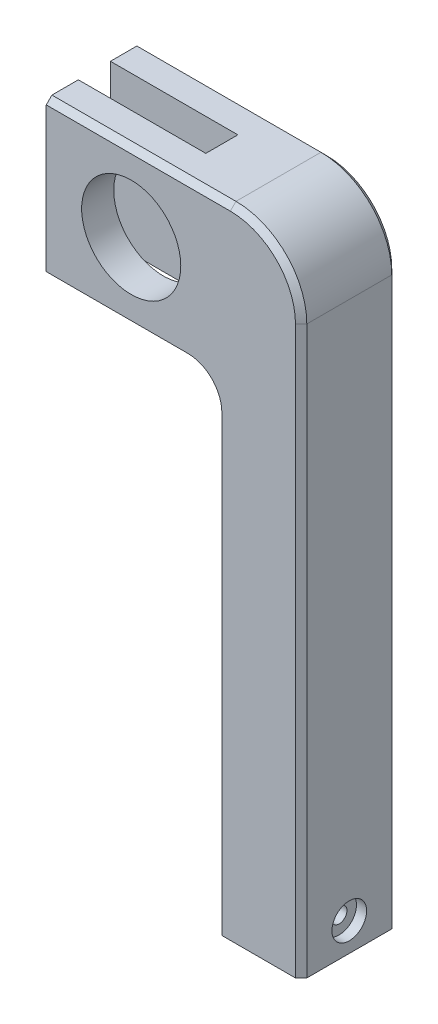
ISO-10303-21;
HEADER;
FILE_DESCRIPTION(('STEP AP214'),'2;1');
FILE_NAME('part.step','',(''),(''),'','','');
FILE_SCHEMA(('AUTOMOTIVE_DESIGN { 1 0 10303 214 1 1 1 1 }'));
ENDSEC;
DATA;
#1=APPLICATION_CONTEXT('core data for automotive mechanical design processes');
#2=APPLICATION_PROTOCOL_DEFINITION('international standard','automotive_design',2000,#1);
#3=PRODUCT_CONTEXT('',#1,'mechanical');
#4=PRODUCT('Part','Part','',(#3));
#5=PRODUCT_RELATED_PRODUCT_CATEGORY('part','',(#4));
#6=PRODUCT_DEFINITION_FORMATION('','',#4);
#7=PRODUCT_DEFINITION_CONTEXT('part definition',#1,'design');
#8=PRODUCT_DEFINITION('design','',#6,#7);
#9=PRODUCT_DEFINITION_SHAPE('','',#8);
#10=(LENGTH_UNIT() NAMED_UNIT(*) SI_UNIT(.MILLI.,.METRE.));
#11=(NAMED_UNIT(*) PLANE_ANGLE_UNIT() SI_UNIT($,.RADIAN.));
#12=(NAMED_UNIT(*) SI_UNIT($,.STERADIAN.) SOLID_ANGLE_UNIT());
#13=UNCERTAINTY_MEASURE_WITH_UNIT(LENGTH_MEASURE(1.E-05),#10,'distance_accuracy_value','');
#14=(GEOMETRIC_REPRESENTATION_CONTEXT(3) GLOBAL_UNCERTAINTY_ASSIGNED_CONTEXT((#13)) GLOBAL_UNIT_ASSIGNED_CONTEXT((#10,
#11,#12)) REPRESENTATION_CONTEXT('',''));
#15=CARTESIAN_POINT('',(0.,0.,0.));
#16=DIRECTION('',(0.,0.,1.));
#17=DIRECTION('',(1.,0.,0.));
#18=AXIS2_PLACEMENT_3D('',#15,#16,#17);
#19=CARTESIAN_POINT('',(-45.,-0.001000000000001,5.66499999999999));
#20=DIRECTION('',(0.,0.,1.));
#21=DIRECTION('',(1.,0.,0.));
#22=AXIS2_PLACEMENT_3D('',#19,#20,#21);
#23=PLANE('',#22);
#24=CARTESIAN_POINT('',(-60.,197.5,5.665));
#25=DIRECTION('',(0.,0.,1.));
#26=DIRECTION('',(1.,0.,0.));
#27=AXIS2_PLACEMENT_3D('',#24,#25,#26);
#28=CIRCLE('',#27,17.5);
#29=CARTESIAN_POINT('',(-45.,188.48612181134,5.66499999999999));
#30=VERTEX_POINT('',#29);
#31=CARTESIAN_POINT('',(-45.,206.51387818866,5.66499999999999));
#32=VERTEX_POINT('',#31);
#33=EDGE_CURVE('E276',#30,#32,#28,.F.);
#34=ORIENTED_EDGE('',*,*,#33,.F.);
#35=DIRECTION('',(0.,1.,0.));
#36=VECTOR('',#35,1.);
#37=CARTESIAN_POINT('',(-45.,-0.001000000000001,5.66499999999999));
#38=LINE('',#37,#36);
#39=CARTESIAN_POINT('',(-45.,170.,5.66499999999999));
#40=VERTEX_POINT('',#39);
#41=EDGE_CURVE('E307',#40,#30,#38,.T.);
#42=ORIENTED_EDGE('',*,*,#41,.F.);
#43=DIRECTION('',(1.,0.,0.));
#44=VECTOR('',#43,1.);
#45=CARTESIAN_POINT('',(-45.,170.,5.66499999999999));
#46=LINE('',#45,#44);
#47=CARTESIAN_POINT('',(-90.,170.,5.665));
#48=VERTEX_POINT('',#47);
#49=EDGE_CURVE('E304',#48,#40,#46,.T.);
#50=ORIENTED_EDGE('',*,*,#49,.F.);
#51=DIRECTION('',(0.,1.,0.));
#52=VECTOR('',#51,1.);
#53=CARTESIAN_POINT('',(-90.,-0.001000000000001,5.665));
#54=LINE('',#53,#52);
#55=CARTESIAN_POINT('',(-90.,225.,5.665));
#56=VERTEX_POINT('',#55);
#57=EDGE_CURVE('E297',#48,#56,#54,.T.);
#58=ORIENTED_EDGE('',*,*,#57,.T.);
#59=DIRECTION('',(1.,0.,0.));
#60=VECTOR('',#59,1.);
#61=CARTESIAN_POINT('',(-45.,225.,5.66499999999999));
#62=LINE('',#61,#60);
#63=CARTESIAN_POINT('',(-45.,225.,5.66499999999999));
#64=VERTEX_POINT('',#63);
#65=EDGE_CURVE('E288',#56,#64,#62,.T.);
#66=ORIENTED_EDGE('',*,*,#65,.T.);
#67=EDGE_CURVE('E313',#32,#64,#38,.T.);
#68=ORIENTED_EDGE('',*,*,#67,.F.);
#69=EDGE_LOOP('',(#34,#42,#50,#58,#66,#68));
#70=FACE_BOUND('',#69,.T.);
#71=ADVANCED_FACE('F50',(#70),#23,.F.);
#72=CARTESIAN_POINT('',(-90.,170.,-17.));
#73=DIRECTION('',(-1.,0.,0.));
#74=DIRECTION('',(0.,-1.,0.));
#75=AXIS2_PLACEMENT_3D('',#72,#73,#74);
#76=PLANE('',#75);
#77=CARTESIAN_POINT('',(-89.9999999999999,175.,-11.33));
#78=DIRECTION('',(-1.,0.,0.));
#79=DIRECTION('',(0.,0.,1.));
#80=AXIS2_PLACEMENT_3D('',#77,#78,#79);
#81=CIRCLE('',#80,1.5);
#82=CARTESIAN_POINT('',(-89.9999999999999,175.,-9.83));
#83=VERTEX_POINT('',#82);
#84=EDGE_CURVE('E214',#83,#83,#81,.T.);
#85=ORIENTED_EDGE('',*,*,#84,.F.);
#86=EDGE_LOOP('',(#85));
#87=FACE_BOUND('',#86,.T.);
#88=CARTESIAN_POINT('',(-89.9999999999999,220.,-11.33));
#89=DIRECTION('',(-1.,0.,0.));
#90=DIRECTION('',(0.,0.,1.));
#91=AXIS2_PLACEMENT_3D('',#88,#89,#90);
#92=CIRCLE('',#91,1.5);
#93=CARTESIAN_POINT('',(-89.9999999999999,220.,-9.83));
#94=VERTEX_POINT('',#93);
#95=EDGE_CURVE('E230',#94,#94,#92,.T.);
#96=ORIENTED_EDGE('',*,*,#95,.F.);
#97=EDGE_LOOP('',(#96));
#98=FACE_BOUND('',#97,.T.);
#99=DIRECTION('',(0.,-1.,0.));
#100=VECTOR('',#99,1.);
#101=CARTESIAN_POINT('',(-90.,170.,-17.));
#102=LINE('',#101,#100);
#103=CARTESIAN_POINT('',(-90.,223.,-17.));
#104=VERTEX_POINT('',#103);
#105=CARTESIAN_POINT('',(-90.,172.,-17.));
#106=VERTEX_POINT('',#105);
#107=EDGE_CURVE('E321',#104,#106,#102,.T.);
#108=ORIENTED_EDGE('',*,*,#107,.T.);
#109=DIRECTION('',(0.,0.707106781186552,-0.707106781186543));
#110=VECTOR('',#109,1.);
#111=CARTESIAN_POINT('',(-90.,171.,-16.));
#112=LINE('',#111,#110);
#113=CARTESIAN_POINT('',(-90.,170.,-14.9999999999999));
#114=VERTEX_POINT('',#113);
#115=EDGE_CURVE('E444',#106,#114,#112,.F.);
#116=ORIENTED_EDGE('',*,*,#115,.T.);
#117=DIRECTION('',(0.,0.,1.));
#118=VECTOR('',#117,1.);
#119=CARTESIAN_POINT('',(-90.,170.,-17.));
#120=LINE('',#119,#118);
#121=CARTESIAN_POINT('',(-90.,170.,-5.665));
#122=VERTEX_POINT('',#121);
#123=EDGE_CURVE('E348',#114,#122,#120,.T.);
#124=ORIENTED_EDGE('',*,*,#123,.T.);
#125=DIRECTION('',(0.,1.,0.));
#126=VECTOR('',#125,1.);
#127=CARTESIAN_POINT('',(-90.,-0.001000000000001,-5.665));
#128=LINE('',#127,#126);
#129=CARTESIAN_POINT('',(-90.,225.,-5.665));
#130=VERTEX_POINT('',#129);
#131=EDGE_CURVE('E301',#122,#130,#128,.T.);
#132=ORIENTED_EDGE('',*,*,#131,.T.);
#133=DIRECTION('',(0.,0.,1.));
#134=VECTOR('',#133,1.);
#135=CARTESIAN_POINT('',(-90.,225.,-17.));
#136=LINE('',#135,#134);
#137=CARTESIAN_POINT('',(-90.,225.,-15.));
#138=VERTEX_POINT('',#137);
#139=EDGE_CURVE('E347',#138,#130,#136,.T.);
#140=ORIENTED_EDGE('',*,*,#139,.F.);
#141=DIRECTION('',(0.,0.707106781186552,0.707106781186543));
#142=VECTOR('',#141,1.);
#143=CARTESIAN_POINT('',(-90.,196.5,-43.5));
#144=LINE('',#143,#142);
#145=EDGE_CURVE('E445',#138,#104,#144,.F.);
#146=ORIENTED_EDGE('',*,*,#145,.T.);
#147=EDGE_LOOP('',(#108,#116,#124,#132,#140,#146));
#148=FACE_BOUND('',#147,.T.);
#149=ADVANCED_FACE('F576',(#87,#98,#148),#76,.T.);
#150=CARTESIAN_POINT('',(-30.,170.,-17.));
#151=DIRECTION('',(0.,-1.,0.));
#152=DIRECTION('',(0.,0.,-1.));
#153=AXIS2_PLACEMENT_3D('',#150,#151,#152);
#154=PLANE('',#153);
#155=DIRECTION('',(0.,0.,1.));
#156=VECTOR('',#155,1.);
#157=CARTESIAN_POINT('',(-40.,170.,17.));
#158=LINE('',#157,#156);
#159=CARTESIAN_POINT('',(-40.,170.,-14.9999999999999));
#160=VERTEX_POINT('',#159);
#161=CARTESIAN_POINT('',(-40.,170.,15.));
#162=VERTEX_POINT('',#161);
#163=EDGE_CURVE('E360',#160,#162,#158,.T.);
#164=ORIENTED_EDGE('',*,*,#163,.T.);
#165=DIRECTION('',(-1.,0.,0.));
#166=VECTOR('',#165,1.);
#167=CARTESIAN_POINT('',(-90.,170.,15.));
#168=LINE('',#167,#166);
#169=CARTESIAN_POINT('',(-90.,170.,15.));
#170=VERTEX_POINT('',#169);
#171=EDGE_CURVE('E393',#162,#170,#168,.T.);
#172=ORIENTED_EDGE('',*,*,#171,.T.);
#173=EDGE_CURVE('E349',#48,#170,#120,.T.);
#174=ORIENTED_EDGE('',*,*,#173,.F.);
#175=ORIENTED_EDGE('',*,*,#49,.T.);
#176=DIRECTION('',(0.,0.,-1.));
#177=VECTOR('',#176,1.);
#178=CARTESIAN_POINT('',(-45.,170.,5.66499999999999));
#179=LINE('',#178,#177);
#180=CARTESIAN_POINT('',(-45.,170.,-5.66499999999999));
#181=VERTEX_POINT('',#180);
#182=EDGE_CURVE('E279',#40,#181,#179,.T.);
#183=ORIENTED_EDGE('',*,*,#182,.T.);
#184=DIRECTION('',(-1.,0.,0.));
#185=VECTOR('',#184,1.);
#186=CARTESIAN_POINT('',(-45.,170.,-5.66499999999999));
#187=LINE('',#186,#185);
#188=EDGE_CURVE('E284',#181,#122,#187,.T.);
#189=ORIENTED_EDGE('',*,*,#188,.T.);
#190=ORIENTED_EDGE('',*,*,#123,.F.);
#191=DIRECTION('',(1.,0.,0.));
#192=VECTOR('',#191,1.);
#193=CARTESIAN_POINT('',(-30.,170.,-14.9999999999999));
#194=LINE('',#193,#192);
#195=EDGE_CURVE('E390',#114,#160,#194,.T.);
#196=ORIENTED_EDGE('',*,*,#195,.T.);
#197=EDGE_LOOP('',(#164,#172,#174,#175,#183,#189,#190,#196));
#198=FACE_BOUND('',#197,.T.);
#199=ADVANCED_FACE('F553',(#198),#154,.T.);
#200=CARTESIAN_POINT('',(0.,225.,-17.));
#201=DIRECTION('',(1.,0.,0.));
#202=DIRECTION('',(0.,1.,0.));
#203=AXIS2_PLACEMENT_3D('',#200,#201,#202);
#204=PLANE('',#203);
#205=CARTESIAN_POINT('',(0.,10.,0.));
#206=DIRECTION('',(1.,0.,0.));
#207=DIRECTION('',(0.,0.,-1.));
#208=AXIS2_PLACEMENT_3D('',#205,#206,#207);
#209=CIRCLE('',#208,6.12);
#210=CARTESIAN_POINT('',(0.,10.,-6.12));
#211=VERTEX_POINT('',#210);
#212=EDGE_CURVE('E244',#211,#211,#209,.T.);
#213=ORIENTED_EDGE('',*,*,#212,.F.);
#214=EDGE_LOOP('',(#213));
#215=FACE_BOUND('',#214,.T.);
#216=DIRECTION('',(0.,0.,1.));
#217=VECTOR('',#216,1.);
#218=CARTESIAN_POINT('',(0.,0.,-17.));
#219=LINE('',#218,#217);
#220=CARTESIAN_POINT('',(0.,0.,-15.));
#221=VERTEX_POINT('',#220);
#222=CARTESIAN_POINT('',(0.,0.,15.));
#223=VERTEX_POINT('',#222);
#224=EDGE_CURVE('E340',#221,#223,#219,.T.);
#225=ORIENTED_EDGE('',*,*,#224,.F.);
#226=DIRECTION('',(0.,1.,0.));
#227=VECTOR('',#226,1.);
#228=CARTESIAN_POINT('',(0.,225.,-15.));
#229=LINE('',#228,#227);
#230=CARTESIAN_POINT('',(0.,200.,-15.));
#231=VERTEX_POINT('',#230);
#232=EDGE_CURVE('E11',#221,#231,#229,.T.);
#233=ORIENTED_EDGE('',*,*,#232,.T.);
#234=DIRECTION('',(0.,0.,1.));
#235=VECTOR('',#234,1.);
#236=CARTESIAN_POINT('',(0.,200.,-17.));
#237=LINE('',#236,#235);
#238=CARTESIAN_POINT('',(0.,200.,15.));
#239=VERTEX_POINT('',#238);
#240=EDGE_CURVE('E341',#231,#239,#237,.T.);
#241=ORIENTED_EDGE('',*,*,#240,.T.);
#242=DIRECTION('',(0.,-1.,0.));
#243=VECTOR('',#242,1.);
#244=CARTESIAN_POINT('',(0.,0.,15.));
#245=LINE('',#244,#243);
#246=EDGE_CURVE('E59',#239,#223,#245,.T.);
#247=ORIENTED_EDGE('',*,*,#246,.T.);
#248=EDGE_LOOP('',(#225,#233,#241,#247));
#249=FACE_BOUND('',#248,.T.);
#250=ADVANCED_FACE('F498',(#215,#249),#204,.T.);
#251=CARTESIAN_POINT('',(0.,0.,-17.));
#252=DIRECTION('',(0.,-1.,0.));
#253=DIRECTION('',(1.,0.,0.));
#254=AXIS2_PLACEMENT_3D('',#251,#252,#253);
#255=PLANE('',#254);
#256=DIRECTION('',(1.,0.,0.));
#257=VECTOR('',#256,1.);
#258=CARTESIAN_POINT('',(0.,0.,17.));
#259=LINE('',#258,#257);
#260=CARTESIAN_POINT('',(-28.,0.,17.));
#261=VERTEX_POINT('',#260);
#262=CARTESIAN_POINT('',(-1.99999999999997,0.,17.));
#263=VERTEX_POINT('',#262);
#264=EDGE_CURVE('E328',#261,#263,#259,.T.);
#265=ORIENTED_EDGE('',*,*,#264,.F.);
#266=DIRECTION('',(-0.707106781186543,0.,-0.707106781186552));
#267=VECTOR('',#266,1.);
#268=CARTESIAN_POINT('',(-31.0000000000002,0.,13.9999999999998));
#269=LINE('',#268,#267);
#270=CARTESIAN_POINT('',(-30.,0.,15.));
#271=VERTEX_POINT('',#270);
#272=EDGE_CURVE('E412',#261,#271,#269,.T.);
#273=ORIENTED_EDGE('',*,*,#272,.T.);
#274=DIRECTION('',(0.,0.,1.));
#275=VECTOR('',#274,1.);
#276=CARTESIAN_POINT('',(-30.,0.,-17.));
#277=LINE('',#276,#275);
#278=CARTESIAN_POINT('',(-30.,0.,-14.9999999999999));
#279=VERTEX_POINT('',#278);
#280=EDGE_CURVE('E345',#279,#271,#277,.T.);
#281=ORIENTED_EDGE('',*,*,#280,.F.);
#282=DIRECTION('',(-0.707106781186552,0.,0.707106781186543));
#283=VECTOR('',#282,1.);
#284=CARTESIAN_POINT('',(-13.9999999999998,0.,-31.));
#285=LINE('',#284,#283);
#286=CARTESIAN_POINT('',(-27.9999999999999,0.,-17.));
#287=VERTEX_POINT('',#286);
#288=EDGE_CURVE('E415',#279,#287,#285,.F.);
#289=ORIENTED_EDGE('',*,*,#288,.T.);
#290=DIRECTION('',(1.,0.,0.));
#291=VECTOR('',#290,1.);
#292=CARTESIAN_POINT('',(0.,0.,-17.));
#293=LINE('',#292,#291);
#294=CARTESIAN_POINT('',(-2.00000000000006,0.,-17.));
#295=VERTEX_POINT('',#294);
#296=EDGE_CURVE('E324',#287,#295,#293,.T.);
#297=ORIENTED_EDGE('',*,*,#296,.T.);
#298=DIRECTION('',(-0.707106781186552,0.,-0.707106781186543));
#299=VECTOR('',#298,1.);
#300=CARTESIAN_POINT('',(-1.00000000000001,0.,-16.));
#301=LINE('',#300,#299);
#302=EDGE_CURVE('E408',#295,#221,#301,.F.);
#303=ORIENTED_EDGE('',*,*,#302,.T.);
#304=ORIENTED_EDGE('',*,*,#224,.T.);
#305=DIRECTION('',(-0.707106781186548,0.,0.707106781186548));
#306=VECTOR('',#305,1.);
#307=CARTESIAN_POINT('',(16.,0.,-0.999999999999987));
#308=LINE('',#307,#306);
#309=EDGE_CURVE('E406',#223,#263,#308,.T.);
#310=ORIENTED_EDGE('',*,*,#309,.T.);
#311=EDGE_LOOP('',(#265,#273,#281,#289,#297,#303,#304,#310));
#312=FACE_BOUND('',#311,.T.);
#313=ADVANCED_FACE('F501',(#312),#255,.T.);
#314=CARTESIAN_POINT('',(-30.,170.,-17.));
#315=DIRECTION('',(-1.,0.,0.));
#316=DIRECTION('',(0.,-1.,0.));
#317=AXIS2_PLACEMENT_3D('',#314,#315,#316);
#318=PLANE('',#317);
#319=CARTESIAN_POINT('',(-30.,10.,0.));
#320=DIRECTION('',(-1.,0.,0.));
#321=DIRECTION('',(0.,-1.,0.));
#322=AXIS2_PLACEMENT_3D('',#319,#320,#321);
#323=CIRCLE('',#322,2.75);
#324=CARTESIAN_POINT('',(-30.,7.25,0.));
#325=VERTEX_POINT('',#324);
#326=EDGE_CURVE('E260',#325,#325,#323,.T.);
#327=ORIENTED_EDGE('',*,*,#326,.F.);
#328=EDGE_LOOP('',(#327));
#329=FACE_BOUND('',#328,.T.);
#330=ORIENTED_EDGE('',*,*,#280,.T.);
#331=DIRECTION('',(0.,1.,0.));
#332=VECTOR('',#331,1.);
#333=CARTESIAN_POINT('',(-30.,160.,15.));
#334=LINE('',#333,#332);
#335=CARTESIAN_POINT('',(-30.,160.,15.));
#336=VERTEX_POINT('',#335);
#337=EDGE_CURVE('E423',#271,#336,#334,.T.);
#338=ORIENTED_EDGE('',*,*,#337,.T.);
#339=DIRECTION('',(0.,0.,1.));
#340=VECTOR('',#339,1.);
#341=CARTESIAN_POINT('',(-30.,160.,-17.));
#342=LINE('',#341,#340);
#343=CARTESIAN_POINT('',(-30.,160.,-14.9999999999999));
#344=VERTEX_POINT('',#343);
#345=EDGE_CURVE('E361',#336,#344,#342,.F.);
#346=ORIENTED_EDGE('',*,*,#345,.T.);
#347=DIRECTION('',(0.,-1.,0.));
#348=VECTOR('',#347,1.);
#349=CARTESIAN_POINT('',(-30.,170.,-14.9999999999999));
#350=LINE('',#349,#348);
#351=EDGE_CURVE('E418',#344,#279,#350,.T.);
#352=ORIENTED_EDGE('',*,*,#351,.T.);
#353=EDGE_LOOP('',(#330,#338,#346,#352));
#354=FACE_BOUND('',#353,.T.);
#355=ADVANCED_FACE('F566',(#329,#354),#318,.T.);
#356=CARTESIAN_POINT('',(-89.9999999999999,220.,11.33));
#357=DIRECTION('',(-1.,0.,0.));
#358=DIRECTION('',(0.,0.,1.));
#359=AXIS2_PLACEMENT_3D('',#356,#357,#358);
#360=CIRCLE('',#359,1.5);
#361=CARTESIAN_POINT('',(-89.9999999999999,220.,12.83));
#362=VERTEX_POINT('',#361);
#363=EDGE_CURVE('E218',#362,#362,#360,.T.);
#364=ORIENTED_EDGE('',*,*,#363,.F.);
#365=EDGE_LOOP('',(#364));
#366=FACE_BOUND('',#365,.T.);
#367=CARTESIAN_POINT('',(-89.9999999999999,175.,11.33));
#368=DIRECTION('',(-1.,0.,0.));
#369=DIRECTION('',(0.,0.,1.));
#370=AXIS2_PLACEMENT_3D('',#367,#368,#369);
#371=CIRCLE('',#370,1.5);
#372=CARTESIAN_POINT('',(-89.9999999999999,175.,12.83));
#373=VERTEX_POINT('',#372);
#374=EDGE_CURVE('E240',#373,#373,#371,.T.);
#375=ORIENTED_EDGE('',*,*,#374,.F.);
#376=EDGE_LOOP('',(#375));
#377=FACE_BOUND('',#376,.T.);
#378=ORIENTED_EDGE('',*,*,#173,.T.);
#379=DIRECTION('',(0.,0.707106781186543,0.707106781186552));
#380=VECTOR('',#379,1.);
#381=CARTESIAN_POINT('',(-90.,154.,-1.00000000000024));
#382=LINE('',#381,#380);
#383=CARTESIAN_POINT('',(-90.,172.,17.));
#384=VERTEX_POINT('',#383);
#385=EDGE_CURVE('E400',#170,#384,#382,.T.);
#386=ORIENTED_EDGE('',*,*,#385,.T.);
#387=DIRECTION('',(0.,-1.,0.));
#388=VECTOR('',#387,1.);
#389=CARTESIAN_POINT('',(-90.,170.,17.));
#390=LINE('',#389,#388);
#391=CARTESIAN_POINT('',(-90.,223.,17.));
#392=VERTEX_POINT('',#391);
#393=EDGE_CURVE('E318',#392,#384,#390,.T.);
#394=ORIENTED_EDGE('',*,*,#393,.F.);
#395=DIRECTION('',(0.,0.707106781186548,-0.707106781186548));
#396=VECTOR('',#395,1.);
#397=CARTESIAN_POINT('',(-90.,213.5,26.5));
#398=LINE('',#397,#396);
#399=CARTESIAN_POINT('',(-90.,225.,15.));
#400=VERTEX_POINT('',#399);
#401=EDGE_CURVE('E394',#392,#400,#398,.T.);
#402=ORIENTED_EDGE('',*,*,#401,.T.);
#403=EDGE_CURVE('E327',#56,#400,#136,.T.);
#404=ORIENTED_EDGE('',*,*,#403,.F.);
#405=ORIENTED_EDGE('',*,*,#57,.F.);
#406=EDGE_LOOP('',(#378,#386,#394,#402,#404,#405));
#407=FACE_BOUND('',#406,.T.);
#408=ADVANCED_FACE('F528',(#366,#377,#407),#76,.T.);
#409=CARTESIAN_POINT('',(-90.,225.,-17.));
#410=DIRECTION('',(0.,1.,0.));
#411=DIRECTION('',(0.,0.,1.));
#412=AXIS2_PLACEMENT_3D('',#409,#410,#411);
#413=PLANE('',#412);
#414=DIRECTION('',(0.,0.,1.));
#415=VECTOR('',#414,1.);
#416=CARTESIAN_POINT('',(-25.,225.,-17.));
#417=LINE('',#416,#415);
#418=CARTESIAN_POINT('',(-25.,225.,15.));
#419=VERTEX_POINT('',#418);
#420=CARTESIAN_POINT('',(-25.,225.,-15.));
#421=VERTEX_POINT('',#420);
#422=EDGE_CURVE('E351',#419,#421,#417,.F.);
#423=ORIENTED_EDGE('',*,*,#422,.T.);
#424=DIRECTION('',(-1.,0.,0.));
#425=VECTOR('',#424,1.);
#426=CARTESIAN_POINT('',(-90.,225.,-15.));
#427=LINE('',#426,#425);
#428=EDGE_CURVE('E451',#421,#138,#427,.T.);
#429=ORIENTED_EDGE('',*,*,#428,.T.);
#430=ORIENTED_EDGE('',*,*,#139,.T.);
#431=DIRECTION('',(-1.,0.,0.));
#432=VECTOR('',#431,1.);
#433=CARTESIAN_POINT('',(-45.,225.,-5.66499999999999));
#434=LINE('',#433,#432);
#435=CARTESIAN_POINT('',(-45.,225.,-5.66499999999999));
#436=VERTEX_POINT('',#435);
#437=EDGE_CURVE('E298',#436,#130,#434,.T.);
#438=ORIENTED_EDGE('',*,*,#437,.F.);
#439=DIRECTION('',(0.,0.,-1.));
#440=VECTOR('',#439,1.);
#441=CARTESIAN_POINT('',(-45.,225.,5.66499999999999));
#442=LINE('',#441,#440);
#443=EDGE_CURVE('E292',#64,#436,#442,.T.);
#444=ORIENTED_EDGE('',*,*,#443,.F.);
#445=ORIENTED_EDGE('',*,*,#65,.F.);
#446=ORIENTED_EDGE('',*,*,#403,.T.);
#447=DIRECTION('',(1.,0.,0.));
#448=VECTOR('',#447,1.);
#449=CARTESIAN_POINT('',(-25.,225.,15.));
#450=LINE('',#449,#448);
#451=EDGE_CURVE('E449',#400,#419,#450,.T.);
#452=ORIENTED_EDGE('',*,*,#451,.T.);
#453=EDGE_LOOP('',(#423,#429,#430,#438,#444,#445,#446,#452));
#454=FACE_BOUND('',#453,.T.);
#455=ADVANCED_FACE('F516',(#454),#413,.T.);
#456=CARTESIAN_POINT('',(0.,0.,-17.));
#457=DIRECTION('',(0.,0.,-1.));
#458=DIRECTION('',(-1.,0.,0.));
#459=AXIS2_PLACEMENT_3D('',#456,#457,#458);
#460=PLANE('',#459);
#461=CARTESIAN_POINT('',(-60.,197.5,-17.));
#462=DIRECTION('',(0.,0.,-1.));
#463=DIRECTION('',(-1.,0.,0.));
#464=AXIS2_PLACEMENT_3D('',#461,#462,#463);
#465=CIRCLE('',#464,11.375);
#466=CARTESIAN_POINT('',(-71.375,197.5,-17.));
#467=VERTEX_POINT('',#466);
#468=EDGE_CURVE('E265',#467,#467,#465,.T.);
#469=ORIENTED_EDGE('',*,*,#468,.F.);
#470=EDGE_LOOP('',(#469));
#471=FACE_BOUND('',#470,.T.);
#472=CARTESIAN_POINT('',(-40.,160.,-17.));
#473=DIRECTION('',(0.,0.,-1.));
#474=DIRECTION('',(-1.,0.,0.));
#475=AXIS2_PLACEMENT_3D('',#472,#473,#474);
#476=CIRCLE('',#475,12.0000000000001);
#477=CARTESIAN_POINT('',(-27.9999999999999,160.,-17.));
#478=VERTEX_POINT('',#477);
#479=CARTESIAN_POINT('',(-40.,172.,-17.));
#480=VERTEX_POINT('',#479);
#481=EDGE_CURVE('E436',#478,#480,#476,.F.);
#482=ORIENTED_EDGE('',*,*,#481,.T.);
#483=DIRECTION('',(-1.,0.,0.));
#484=VECTOR('',#483,1.);
#485=CARTESIAN_POINT('',(0.,172.,-17.));
#486=LINE('',#485,#484);
#487=EDGE_CURVE('E437',#480,#106,#486,.T.);
#488=ORIENTED_EDGE('',*,*,#487,.T.);
#489=ORIENTED_EDGE('',*,*,#107,.F.);
#490=DIRECTION('',(1.,0.,0.));
#491=VECTOR('',#490,1.);
#492=CARTESIAN_POINT('',(0.,223.,-17.));
#493=LINE('',#492,#491);
#494=CARTESIAN_POINT('',(-25.,223.,-17.));
#495=VERTEX_POINT('',#494);
#496=EDGE_CURVE('E427',#104,#495,#493,.T.);
#497=ORIENTED_EDGE('',*,*,#496,.T.);
#498=CARTESIAN_POINT('',(-25.,200.,-17.));
#499=DIRECTION('',(0.,0.,-1.));
#500=DIRECTION('',(-1.,0.,0.));
#501=AXIS2_PLACEMENT_3D('',#498,#499,#500);
#502=CIRCLE('',#501,22.9999999999999);
#503=CARTESIAN_POINT('',(-2.00000000000005,200.,-17.));
#504=VERTEX_POINT('',#503);
#505=EDGE_CURVE('E430',#495,#504,#502,.T.);
#506=ORIENTED_EDGE('',*,*,#505,.T.);
#507=DIRECTION('',(0.,-1.,0.));
#508=VECTOR('',#507,1.);
#509=CARTESIAN_POINT('',(-2.00000000000006,0.,-17.));
#510=LINE('',#509,#508);
#511=EDGE_CURVE('E425',#504,#295,#510,.T.);
#512=ORIENTED_EDGE('',*,*,#511,.T.);
#513=ORIENTED_EDGE('',*,*,#296,.F.);
#514=DIRECTION('',(0.,1.,0.));
#515=VECTOR('',#514,1.);
#516=CARTESIAN_POINT('',(-27.9999999999999,0.,-17.));
#517=LINE('',#516,#515);
#518=EDGE_CURVE('E433',#287,#478,#517,.T.);
#519=ORIENTED_EDGE('',*,*,#518,.T.);
#520=EDGE_LOOP('',(#482,#488,#489,#497,#506,#512,#513,#519));
#521=FACE_BOUND('',#520,.T.);
#522=ADVANCED_FACE('F572',(#471,#521),#460,.T.);
#523=CARTESIAN_POINT('',(0.,0.,17.));
#524=DIRECTION('',(0.,0.,-1.));
#525=DIRECTION('',(-1.,0.,0.));
#526=AXIS2_PLACEMENT_3D('',#523,#524,#525);
#527=PLANE('',#526);
#528=CARTESIAN_POINT('',(-60.,197.5,17.));
#529=DIRECTION('',(0.,0.,1.));
#530=DIRECTION('',(1.,0.,0.));
#531=AXIS2_PLACEMENT_3D('',#528,#529,#530);
#532=CIRCLE('',#531,17.5);
#533=CARTESIAN_POINT('',(-42.5,197.5,17.));
#534=VERTEX_POINT('',#533);
#535=EDGE_CURVE('E272',#534,#534,#532,.T.);
#536=ORIENTED_EDGE('',*,*,#535,.F.);
#537=EDGE_LOOP('',(#536));
#538=FACE_BOUND('',#537,.T.);
#539=ORIENTED_EDGE('',*,*,#393,.T.);
#540=DIRECTION('',(1.,0.,0.));
#541=VECTOR('',#540,1.);
#542=CARTESIAN_POINT('',(-40.,172.,17.));
#543=LINE('',#542,#541);
#544=CARTESIAN_POINT('',(-40.,172.,17.));
#545=VERTEX_POINT('',#544);
#546=EDGE_CURVE('E384',#384,#545,#543,.T.);
#547=ORIENTED_EDGE('',*,*,#546,.T.);
#548=CARTESIAN_POINT('',(-40.,160.,17.));
#549=DIRECTION('',(0.,0.,-1.));
#550=DIRECTION('',(-1.,0.,0.));
#551=AXIS2_PLACEMENT_3D('',#548,#549,#550);
#552=CIRCLE('',#551,12.);
#553=CARTESIAN_POINT('',(-28.,160.,17.));
#554=VERTEX_POINT('',#553);
#555=EDGE_CURVE('E379',#545,#554,#552,.T.);
#556=ORIENTED_EDGE('',*,*,#555,.T.);
#557=DIRECTION('',(0.,-1.,0.));
#558=VECTOR('',#557,1.);
#559=CARTESIAN_POINT('',(-28.,0.,17.));
#560=LINE('',#559,#558);
#561=EDGE_CURVE('E380',#554,#261,#560,.T.);
#562=ORIENTED_EDGE('',*,*,#561,.T.);
#563=ORIENTED_EDGE('',*,*,#264,.T.);
#564=DIRECTION('',(0.,1.,0.));
#565=VECTOR('',#564,1.);
#566=CARTESIAN_POINT('',(-1.99999999999997,200.,17.));
#567=LINE('',#566,#565);
#568=CARTESIAN_POINT('',(-1.99999999999997,200.,17.));
#569=VERTEX_POINT('',#568);
#570=EDGE_CURVE('E370',#263,#569,#567,.T.);
#571=ORIENTED_EDGE('',*,*,#570,.T.);
#572=CARTESIAN_POINT('',(-25.,200.,17.));
#573=DIRECTION('',(0.,0.,-1.));
#574=DIRECTION('',(-1.,0.,0.));
#575=AXIS2_PLACEMENT_3D('',#572,#573,#574);
#576=CIRCLE('',#575,23.);
#577=CARTESIAN_POINT('',(-25.,223.,17.));
#578=VERTEX_POINT('',#577);
#579=EDGE_CURVE('E369',#569,#578,#576,.F.);
#580=ORIENTED_EDGE('',*,*,#579,.T.);
#581=DIRECTION('',(-1.,0.,0.));
#582=VECTOR('',#581,1.);
#583=CARTESIAN_POINT('',(-90.,223.,17.));
#584=LINE('',#583,#582);
#585=EDGE_CURVE('E373',#578,#392,#584,.T.);
#586=ORIENTED_EDGE('',*,*,#585,.T.);
#587=EDGE_LOOP('',(#539,#547,#556,#562,#563,#571,#580,#586));
#588=FACE_BOUND('',#587,.T.);
#589=ADVANCED_FACE('F522',(#538,#588),#527,.F.);
#590=CARTESIAN_POINT('',(-45.,-0.001000000000001,-5.66499999999999));
#591=DIRECTION('',(0.,0.,-1.));
#592=DIRECTION('',(-1.,0.,0.));
#593=AXIS2_PLACEMENT_3D('',#590,#591,#592);
#594=PLANE('',#593);
#595=CARTESIAN_POINT('',(-60.,197.5,-5.665));
#596=DIRECTION('',(0.,0.,-1.));
#597=DIRECTION('',(-1.,0.,0.));
#598=AXIS2_PLACEMENT_3D('',#595,#596,#597);
#599=CIRCLE('',#598,11.375);
#600=CARTESIAN_POINT('',(-71.375,197.5,-5.665));
#601=VERTEX_POINT('',#600);
#602=EDGE_CURVE('E267',#601,#601,#599,.F.);
#603=ORIENTED_EDGE('',*,*,#602,.F.);
#604=EDGE_LOOP('',(#603));
#605=FACE_BOUND('',#604,.T.);
#606=DIRECTION('',(0.,1.,0.));
#607=VECTOR('',#606,1.);
#608=CARTESIAN_POINT('',(-45.,-0.001000000000001,-5.66499999999999));
#609=LINE('',#608,#607);
#610=EDGE_CURVE('E306',#181,#436,#609,.T.);
#611=ORIENTED_EDGE('',*,*,#610,.T.);
#612=ORIENTED_EDGE('',*,*,#437,.T.);
#613=ORIENTED_EDGE('',*,*,#131,.F.);
#614=ORIENTED_EDGE('',*,*,#188,.F.);
#615=EDGE_LOOP('',(#611,#612,#613,#614));
#616=FACE_BOUND('',#615,.T.);
#617=ADVANCED_FACE('F583',(#605,#616),#594,.F.);
#618=CARTESIAN_POINT('',(-45.,-0.001000000000001,5.66499999999999));
#619=DIRECTION('',(1.,0.,0.));
#620=DIRECTION('',(0.,0.,-1.));
#621=AXIS2_PLACEMENT_3D('',#618,#619,#620);
#622=PLANE('',#621);
#623=ORIENTED_EDGE('',*,*,#41,.T.);
#624=EDGE_CURVE('E312',#30,#32,#38,.T.);
#625=ORIENTED_EDGE('',*,*,#624,.T.);
#626=ORIENTED_EDGE('',*,*,#67,.T.);
#627=ORIENTED_EDGE('',*,*,#443,.T.);
#628=ORIENTED_EDGE('',*,*,#610,.F.);
#629=ORIENTED_EDGE('',*,*,#182,.F.);
#630=EDGE_LOOP('',(#623,#625,#626,#627,#628,#629));
#631=FACE_BOUND('',#630,.T.);
#632=ADVANCED_FACE('F590',(#631),#622,.F.);
#633=CARTESIAN_POINT('',(-25.,200.,-17.));
#634=DIRECTION('',(0.,0.,1.));
#635=DIRECTION('',(1.,0.,0.));
#636=AXIS2_PLACEMENT_3D('',#633,#634,#635);
#637=CYLINDRICAL_SURFACE('',#636,25.);
#638=ORIENTED_EDGE('',*,*,#240,.F.);
#639=CARTESIAN_POINT('',(-25.,200.,-15.));
#640=DIRECTION('',(0.,0.,-1.));
#641=DIRECTION('',(-1.,0.,0.));
#642=AXIS2_PLACEMENT_3D('',#639,#640,#641);
#643=CIRCLE('',#642,25.);
#644=EDGE_CURVE('E460',#231,#421,#643,.F.);
#645=ORIENTED_EDGE('',*,*,#644,.T.);
#646=ORIENTED_EDGE('',*,*,#422,.F.);
#647=CARTESIAN_POINT('',(-25.,200.,15.));
#648=DIRECTION('',(0.,0.,-1.));
#649=DIRECTION('',(-1.,0.,0.));
#650=AXIS2_PLACEMENT_3D('',#647,#648,#649);
#651=CIRCLE('',#650,25.);
#652=EDGE_CURVE('E68',#419,#239,#651,.T.);
#653=ORIENTED_EDGE('',*,*,#652,.T.);
#654=EDGE_LOOP('',(#638,#645,#646,#653));
#655=FACE_BOUND('',#654,.T.);
#656=ADVANCED_FACE('F511',(#655),#637,.T.);
#657=CARTESIAN_POINT('',(-40.,160.,-17.));
#658=DIRECTION('',(0.,0.,-1.));
#659=DIRECTION('',(-1.,0.,0.));
#660=AXIS2_PLACEMENT_3D('',#657,#658,#659);
#661=CYLINDRICAL_SURFACE('',#660,10.);
#662=ORIENTED_EDGE('',*,*,#345,.F.);
#663=CARTESIAN_POINT('',(-40.,160.,15.));
#664=DIRECTION('',(0.,0.,-1.));
#665=DIRECTION('',(-1.,0.,0.));
#666=AXIS2_PLACEMENT_3D('',#663,#664,#665);
#667=CIRCLE('',#666,10.);
#668=EDGE_CURVE('E401',#336,#162,#667,.F.);
#669=ORIENTED_EDGE('',*,*,#668,.T.);
#670=ORIENTED_EDGE('',*,*,#163,.F.);
#671=CARTESIAN_POINT('',(-40.,160.,-14.9999999999999));
#672=DIRECTION('',(0.,0.,-1.));
#673=DIRECTION('',(-1.,0.,0.));
#674=AXIS2_PLACEMENT_3D('',#671,#672,#673);
#675=CIRCLE('',#674,10.);
#676=EDGE_CURVE('E396',#160,#344,#675,.T.);
#677=ORIENTED_EDGE('',*,*,#676,.T.);
#678=EDGE_LOOP('',(#662,#669,#670,#677));
#679=FACE_BOUND('',#678,.T.);
#680=ADVANCED_FACE('F549',(#679),#661,.F.);
#681=CARTESIAN_POINT('',(-60.,197.5,-43.8324746830584));
#682=DIRECTION('',(0.,0.,1.));
#683=DIRECTION('',(1.,0.,0.));
#684=AXIS2_PLACEMENT_3D('',#681,#682,#683);
#685=CYLINDRICAL_SURFACE('',#684,17.5);
#686=ORIENTED_EDGE('',*,*,#33,.T.);
#687=EDGE_CURVE('E273',#32,#30,#28,.F.);
#688=ORIENTED_EDGE('',*,*,#687,.T.);
#689=EDGE_LOOP('',(#686,#688));
#690=FACE_BOUND('',#689,.T.);
#691=ORIENTED_EDGE('',*,*,#535,.T.);
#692=EDGE_LOOP('',(#691));
#693=FACE_BOUND('',#692,.T.);
#694=ADVANCED_FACE('F596',(#690,#693),#685,.F.);
#695=CARTESIAN_POINT('',(-45.,-0.001000000000001,5.66499999999999));
#696=DIRECTION('',(0.,0.,1.));
#697=DIRECTION('',(1.,0.,0.));
#698=AXIS2_PLACEMENT_3D('',#695,#696,#697);
#699=PLANE('',#698);
#700=ORIENTED_EDGE('',*,*,#687,.F.);
#701=ORIENTED_EDGE('',*,*,#624,.F.);
#702=EDGE_LOOP('',(#700,#701));
#703=FACE_BOUND('',#702,.T.);
#704=ADVANCED_FACE('F605',(#703),#699,.T.);
#705=CARTESIAN_POINT('',(-60.,197.5,17.001));
#706=DIRECTION('',(0.,0.,-1.));
#707=DIRECTION('',(-1.,0.,0.));
#708=AXIS2_PLACEMENT_3D('',#705,#706,#707);
#709=CYLINDRICAL_SURFACE('',#708,11.375);
#710=ORIENTED_EDGE('',*,*,#468,.T.);
#711=EDGE_LOOP('',(#710));
#712=FACE_BOUND('',#711,.T.);
#713=ORIENTED_EDGE('',*,*,#602,.T.);
#714=EDGE_LOOP('',(#713));
#715=FACE_BOUND('',#714,.T.);
#716=ADVANCED_FACE('F652',(#712,#715),#709,.F.);
#717=CARTESIAN_POINT('',(-28.,0.,17.));
#718=DIRECTION('',(-0.707106781186552,0.,0.707106781186542));
#719=DIRECTION('',(0.,1.,0.));
#720=AXIS2_PLACEMENT_3D('',#717,#718,#719);
#721=PLANE('',#720);
#722=ORIENTED_EDGE('',*,*,#272,.F.);
#723=ORIENTED_EDGE('',*,*,#561,.F.);
#724=DIRECTION('',(0.707106781186542,0.,0.707106781186552));
#725=VECTOR('',#724,1.);
#726=CARTESIAN_POINT('',(-30.,160.,15.));
#727=LINE('',#726,#725);
#728=EDGE_CURVE('E270',#336,#554,#727,.T.);
#729=ORIENTED_EDGE('',*,*,#728,.F.);
#730=ORIENTED_EDGE('',*,*,#337,.F.);
#731=EDGE_LOOP('',(#722,#723,#729,#730));
#732=FACE_BOUND('',#731,.T.);
#733=ADVANCED_FACE('F545',(#732),#721,.T.);
#734=CARTESIAN_POINT('',(-40.,160.,17.));
#735=DIRECTION('',(0.,0.,1.));
#736=DIRECTION('',(1.,0.,0.));
#737=AXIS2_PLACEMENT_3D('',#734,#735,#736);
#738=CONICAL_SURFACE('',#737,12.,0.785398163397444);
#739=ORIENTED_EDGE('',*,*,#728,.T.);
#740=ORIENTED_EDGE('',*,*,#555,.F.);
#741=DIRECTION('',(0.,0.707106781186542,0.707106781186552));
#742=VECTOR('',#741,1.);
#743=CARTESIAN_POINT('',(-40.,170.,15.));
#744=LINE('',#743,#742);
#745=EDGE_CURVE('E465',#162,#545,#744,.T.);
#746=ORIENTED_EDGE('',*,*,#745,.F.);
#747=ORIENTED_EDGE('',*,*,#668,.F.);
#748=EDGE_LOOP('',(#739,#740,#746,#747));
#749=FACE_BOUND('',#748,.T.);
#750=ADVANCED_FACE('F542',(#749),#738,.F.);
#751=CARTESIAN_POINT('',(0.,172.,17.));
#752=DIRECTION('',(0.,-0.707106781186552,0.707106781186542));
#753=DIRECTION('',(-1.,0.,0.));
#754=AXIS2_PLACEMENT_3D('',#751,#752,#753);
#755=PLANE('',#754);
#756=ORIENTED_EDGE('',*,*,#385,.F.);
#757=ORIENTED_EDGE('',*,*,#171,.F.);
#758=ORIENTED_EDGE('',*,*,#745,.T.);
#759=ORIENTED_EDGE('',*,*,#546,.F.);
#760=EDGE_LOOP('',(#756,#757,#758,#759));
#761=FACE_BOUND('',#760,.T.);
#762=ADVANCED_FACE('F534',(#761),#755,.T.);
#763=CARTESIAN_POINT('',(-30.,170.,-14.9999999999999));
#764=DIRECTION('',(0.707106781186543,0.,0.707106781186552));
#765=DIRECTION('',(0.,-1.,0.));
#766=AXIS2_PLACEMENT_3D('',#763,#764,#765);
#767=PLANE('',#766);
#768=ORIENTED_EDGE('',*,*,#288,.F.);
#769=ORIENTED_EDGE('',*,*,#351,.F.);
#770=DIRECTION('',(-0.707106781186552,0.,0.707106781186543));
#771=VECTOR('',#770,1.);
#772=CARTESIAN_POINT('',(-27.9999999999999,160.,-17.));
#773=LINE('',#772,#771);
#774=EDGE_CURVE('E461',#478,#344,#773,.T.);
#775=ORIENTED_EDGE('',*,*,#774,.F.);
#776=ORIENTED_EDGE('',*,*,#518,.F.);
#777=EDGE_LOOP('',(#768,#769,#775,#776));
#778=FACE_BOUND('',#777,.T.);
#779=ADVANCED_FACE('F569',(#778),#767,.F.);
#780=CARTESIAN_POINT('',(-40.,160.,-17.));
#781=DIRECTION('',(0.,0.,-1.));
#782=DIRECTION('',(-1.,0.,0.));
#783=AXIS2_PLACEMENT_3D('',#780,#781,#782);
#784=CONICAL_SURFACE('',#783,12.0000000000001,0.785398163397457);
#785=ORIENTED_EDGE('',*,*,#774,.T.);
#786=ORIENTED_EDGE('',*,*,#676,.F.);
#787=DIRECTION('',(0.,-0.707106781186552,0.707106781186543));
#788=VECTOR('',#787,1.);
#789=CARTESIAN_POINT('',(-40.,172.,-17.));
#790=LINE('',#789,#788);
#791=EDGE_CURVE('E469',#480,#160,#790,.T.);
#792=ORIENTED_EDGE('',*,*,#791,.F.);
#793=ORIENTED_EDGE('',*,*,#481,.F.);
#794=EDGE_LOOP('',(#785,#786,#792,#793));
#795=FACE_BOUND('',#794,.T.);
#796=ADVANCED_FACE('F565',(#795),#784,.F.);
#797=CARTESIAN_POINT('',(-30.,170.,-14.9999999999999));
#798=DIRECTION('',(0.,0.707106781186543,0.707106781186552));
#799=DIRECTION('',(1.,0.,0.));
#800=AXIS2_PLACEMENT_3D('',#797,#798,#799);
#801=PLANE('',#800);
#802=ORIENTED_EDGE('',*,*,#115,.F.);
#803=ORIENTED_EDGE('',*,*,#487,.F.);
#804=ORIENTED_EDGE('',*,*,#791,.T.);
#805=ORIENTED_EDGE('',*,*,#195,.F.);
#806=EDGE_LOOP('',(#802,#803,#804,#805));
#807=FACE_BOUND('',#806,.T.);
#808=ADVANCED_FACE('F558',(#807),#801,.F.);
#809=CARTESIAN_POINT('',(0.,225.,-15.));
#810=DIRECTION('',(-0.707106781186543,0.,0.707106781186552));
#811=DIRECTION('',(0.,1.,0.));
#812=AXIS2_PLACEMENT_3D('',#809,#810,#811);
#813=PLANE('',#812);
#814=ORIENTED_EDGE('',*,*,#302,.F.);
#815=ORIENTED_EDGE('',*,*,#511,.F.);
#816=DIRECTION('',(-0.707106781186552,0.,-0.707106781186543));
#817=VECTOR('',#816,1.);
#818=CARTESIAN_POINT('',(0.,200.,-15.));
#819=LINE('',#818,#817);
#820=EDGE_CURVE('E475',#231,#504,#819,.T.);
#821=ORIENTED_EDGE('',*,*,#820,.F.);
#822=ORIENTED_EDGE('',*,*,#232,.F.);
#823=EDGE_LOOP('',(#814,#815,#821,#822));
#824=FACE_BOUND('',#823,.T.);
#825=ADVANCED_FACE('F506',(#824),#813,.F.);
#826=CARTESIAN_POINT('',(-25.,200.,-17.));
#827=DIRECTION('',(0.,0.,1.));
#828=DIRECTION('',(1.,0.,0.));
#829=AXIS2_PLACEMENT_3D('',#826,#827,#828);
#830=CONICAL_SURFACE('',#829,22.9999999999999,0.785398163397457);
#831=ORIENTED_EDGE('',*,*,#820,.T.);
#832=ORIENTED_EDGE('',*,*,#505,.F.);
#833=DIRECTION('',(0.,-0.707106781186552,-0.707106781186543));
#834=VECTOR('',#833,1.);
#835=CARTESIAN_POINT('',(-25.,225.,-15.));
#836=LINE('',#835,#834);
#837=EDGE_CURVE('E478',#421,#495,#836,.T.);
#838=ORIENTED_EDGE('',*,*,#837,.F.);
#839=ORIENTED_EDGE('',*,*,#644,.F.);
#840=EDGE_LOOP('',(#831,#832,#838,#839));
#841=FACE_BOUND('',#840,.T.);
#842=ADVANCED_FACE('F515',(#841),#830,.T.);
#843=CARTESIAN_POINT('',(-90.,225.,-15.));
#844=DIRECTION('',(0.,-0.707106781186543,0.707106781186552));
#845=DIRECTION('',(-1.,0.,0.));
#846=AXIS2_PLACEMENT_3D('',#843,#844,#845);
#847=PLANE('',#846);
#848=ORIENTED_EDGE('',*,*,#837,.T.);
#849=ORIENTED_EDGE('',*,*,#496,.F.);
#850=ORIENTED_EDGE('',*,*,#145,.F.);
#851=ORIENTED_EDGE('',*,*,#428,.F.);
#852=EDGE_LOOP('',(#848,#849,#850,#851));
#853=FACE_BOUND('',#852,.T.);
#854=ADVANCED_FACE('F580',(#853),#847,.F.);
#855=CARTESIAN_POINT('',(-1.99999999999997,0.,17.));
#856=DIRECTION('',(0.707106781186547,0.,0.707106781186547));
#857=DIRECTION('',(0.,-1.,0.));
#858=AXIS2_PLACEMENT_3D('',#855,#856,#857);
#859=PLANE('',#858);
#860=ORIENTED_EDGE('',*,*,#309,.F.);
#861=ORIENTED_EDGE('',*,*,#246,.F.);
#862=DIRECTION('',(0.707106781186547,0.,-0.707106781186547));
#863=VECTOR('',#862,1.);
#864=CARTESIAN_POINT('',(-1.99999999999997,200.,17.));
#865=LINE('',#864,#863);
#866=EDGE_CURVE('E55',#569,#239,#865,.T.);
#867=ORIENTED_EDGE('',*,*,#866,.F.);
#868=ORIENTED_EDGE('',*,*,#570,.F.);
#869=EDGE_LOOP('',(#860,#861,#867,#868));
#870=FACE_BOUND('',#869,.T.);
#871=ADVANCED_FACE('F49',(#870),#859,.T.);
#872=CARTESIAN_POINT('',(-25.,200.,17.));
#873=DIRECTION('',(0.,0.,-1.));
#874=DIRECTION('',(-1.,0.,0.));
#875=AXIS2_PLACEMENT_3D('',#872,#873,#874);
#876=CONICAL_SURFACE('',#875,23.,0.78539816339745);
#877=ORIENTED_EDGE('',*,*,#866,.T.);
#878=ORIENTED_EDGE('',*,*,#652,.F.);
#879=DIRECTION('',(0.,0.707106781186547,-0.707106781186547));
#880=VECTOR('',#879,1.);
#881=CARTESIAN_POINT('',(-25.,223.,17.));
#882=LINE('',#881,#880);
#883=EDGE_CURVE('E263',#578,#419,#882,.T.);
#884=ORIENTED_EDGE('',*,*,#883,.F.);
#885=ORIENTED_EDGE('',*,*,#579,.F.);
#886=EDGE_LOOP('',(#877,#878,#884,#885));
#887=FACE_BOUND('',#886,.T.);
#888=ADVANCED_FACE('F491',(#887),#876,.T.);
#889=CARTESIAN_POINT('',(0.,223.,17.));
#890=DIRECTION('',(0.,0.707106781186547,0.707106781186547));
#891=DIRECTION('',(1.,0.,0.));
#892=AXIS2_PLACEMENT_3D('',#889,#890,#891);
#893=PLANE('',#892);
#894=ORIENTED_EDGE('',*,*,#883,.T.);
#895=ORIENTED_EDGE('',*,*,#451,.F.);
#896=ORIENTED_EDGE('',*,*,#401,.F.);
#897=ORIENTED_EDGE('',*,*,#585,.F.);
#898=EDGE_LOOP('',(#894,#895,#896,#897));
#899=FACE_BOUND('',#898,.T.);
#900=ADVANCED_FACE('F523',(#899),#893,.T.);
#901=CARTESIAN_POINT('',(0.,10.,0.));
#902=DIRECTION('',(1.,0.,0.));
#903=DIRECTION('',(0.,0.,-1.));
#904=AXIS2_PLACEMENT_3D('',#901,#902,#903);
#905=CYLINDRICAL_SURFACE('',#904,2.75);
#906=CARTESIAN_POINT('',(-3.58,10.,0.));
#907=DIRECTION('',(1.,0.,0.));
#908=DIRECTION('',(0.,0.,-1.));
#909=AXIS2_PLACEMENT_3D('',#906,#907,#908);
#910=CIRCLE('',#909,2.75);
#911=CARTESIAN_POINT('',(-3.58,10.,-2.75));
#912=VERTEX_POINT('',#911);
#913=EDGE_CURVE('E254',#912,#912,#910,.T.);
#914=ORIENTED_EDGE('',*,*,#913,.T.);
#915=EDGE_LOOP('',(#914));
#916=FACE_BOUND('',#915,.T.);
#917=ORIENTED_EDGE('',*,*,#326,.T.);
#918=EDGE_LOOP('',(#917));
#919=FACE_BOUND('',#918,.T.);
#920=ADVANCED_FACE('F687',(#916,#919),#905,.F.);
#921=CARTESIAN_POINT('',(-3.58,12.75,0.));
#922=DIRECTION('',(-1.,0.,0.));
#923=DIRECTION('',(0.,0.,1.));
#924=AXIS2_PLACEMENT_3D('',#921,#922,#923);
#925=PLANE('',#924);
#926=ORIENTED_EDGE('',*,*,#913,.F.);
#927=EDGE_LOOP('',(#926));
#928=FACE_BOUND('',#927,.T.);
#929=CARTESIAN_POINT('',(-3.58,10.,0.));
#930=DIRECTION('',(1.,0.,0.));
#931=DIRECTION('',(0.,0.,-1.));
#932=AXIS2_PLACEMENT_3D('',#929,#930,#931);
#933=CIRCLE('',#932,6.12);
#934=CARTESIAN_POINT('',(-3.58,10.,-6.12));
#935=VERTEX_POINT('',#934);
#936=EDGE_CURVE('E248',#935,#935,#933,.T.);
#937=ORIENTED_EDGE('',*,*,#936,.T.);
#938=EDGE_LOOP('',(#937));
#939=FACE_BOUND('',#938,.T.);
#940=ADVANCED_FACE('F851',(#928,#939),#925,.F.);
#941=CARTESIAN_POINT('',(0.,10.,0.));
#942=DIRECTION('',(1.,0.,0.));
#943=DIRECTION('',(0.,0.,-1.));
#944=AXIS2_PLACEMENT_3D('',#941,#942,#943);
#945=CYLINDRICAL_SURFACE('',#944,6.12);
#946=ORIENTED_EDGE('',*,*,#936,.F.);
#947=EDGE_LOOP('',(#946));
#948=FACE_BOUND('',#947,.T.);
#949=ORIENTED_EDGE('',*,*,#212,.T.);
#950=EDGE_LOOP('',(#949));
#951=FACE_BOUND('',#950,.T.);
#952=ADVANCED_FACE('F863',(#948,#951),#945,.F.);
#953=CARTESIAN_POINT('',(-69.9999999999999,175.,11.33));
#954=DIRECTION('',(-1.,0.,0.));
#955=DIRECTION('',(0.,0.,1.));
#956=AXIS2_PLACEMENT_3D('',#953,#954,#955);
#957=CONICAL_SURFACE('',#956,1.5,1.02974425867666);
#958=CARTESIAN_POINT('',(-69.0987090714586,175.,11.33));
#959=VERTEX_POINT('',#958);
#960=VERTEX_LOOP('',#959);
#961=FACE_BOUND('',#960,.T.);
#962=CARTESIAN_POINT('',(-69.9999999999999,175.,11.33));
#963=DIRECTION('',(-1.,0.,0.));
#964=DIRECTION('',(0.,0.,1.));
#965=AXIS2_PLACEMENT_3D('',#962,#963,#964);
#966=CIRCLE('',#965,1.5);
#967=CARTESIAN_POINT('',(-69.9999999999999,175.,12.83));
#968=VERTEX_POINT('',#967);
#969=EDGE_CURVE('E241',#968,#968,#966,.T.);
#970=ORIENTED_EDGE('',*,*,#969,.T.);
#971=EDGE_LOOP('',(#970));
#972=FACE_BOUND('',#971,.T.);
#973=ADVANCED_FACE('F873',(#961,#972),#957,.F.);
#974=CARTESIAN_POINT('',(-89.9999999999999,175.,11.33));
#975=DIRECTION('',(-1.,0.,0.));
#976=DIRECTION('',(0.,0.,1.));
#977=AXIS2_PLACEMENT_3D('',#974,#975,#976);
#978=CYLINDRICAL_SURFACE('',#977,1.5);
#979=ORIENTED_EDGE('',*,*,#969,.F.);
#980=EDGE_LOOP('',(#979));
#981=FACE_BOUND('',#980,.T.);
#982=ORIENTED_EDGE('',*,*,#374,.T.);
#983=EDGE_LOOP('',(#982));
#984=FACE_BOUND('',#983,.T.);
#985=ADVANCED_FACE('F885',(#981,#984),#978,.F.);
#986=CARTESIAN_POINT('',(-69.9999999999999,220.,-11.33));
#987=DIRECTION('',(-1.,0.,0.));
#988=DIRECTION('',(0.,0.,1.));
#989=AXIS2_PLACEMENT_3D('',#986,#987,#988);
#990=CONICAL_SURFACE('',#989,1.5,1.02974425867666);
#991=CARTESIAN_POINT('',(-69.0987090714586,220.,-11.33));
#992=VERTEX_POINT('',#991);
#993=VERTEX_LOOP('',#992);
#994=FACE_BOUND('',#993,.T.);
#995=CARTESIAN_POINT('',(-69.9999999999999,220.,-11.33));
#996=DIRECTION('',(-1.,0.,0.));
#997=DIRECTION('',(0.,0.,1.));
#998=AXIS2_PLACEMENT_3D('',#995,#996,#997);
#999=CIRCLE('',#998,1.5);
#1000=CARTESIAN_POINT('',(-69.9999999999999,220.,-9.83));
#1001=VERTEX_POINT('',#1000);
#1002=EDGE_CURVE('E231',#1001,#1001,#999,.T.);
#1003=ORIENTED_EDGE('',*,*,#1002,.T.);
#1004=EDGE_LOOP('',(#1003));
#1005=FACE_BOUND('',#1004,.T.);
#1006=ADVANCED_FACE('F891',(#994,#1005),#990,.F.);
#1007=CARTESIAN_POINT('',(-89.9999999999999,220.,-11.33));
#1008=DIRECTION('',(-1.,0.,0.));
#1009=DIRECTION('',(0.,0.,1.));
#1010=AXIS2_PLACEMENT_3D('',#1007,#1008,#1009);
#1011=CYLINDRICAL_SURFACE('',#1010,1.5);
#1012=ORIENTED_EDGE('',*,*,#1002,.F.);
#1013=EDGE_LOOP('',(#1012));
#1014=FACE_BOUND('',#1013,.T.);
#1015=ORIENTED_EDGE('',*,*,#95,.T.);
#1016=EDGE_LOOP('',(#1015));
#1017=FACE_BOUND('',#1016,.T.);
#1018=ADVANCED_FACE('F899',(#1014,#1017),#1011,.F.);
#1019=CARTESIAN_POINT('',(-69.9999999999999,175.,-11.33));
#1020=DIRECTION('',(-1.,0.,0.));
#1021=DIRECTION('',(0.,0.,1.));
#1022=AXIS2_PLACEMENT_3D('',#1019,#1020,#1021);
#1023=CONICAL_SURFACE('',#1022,1.5,1.02974425867666);
#1024=CARTESIAN_POINT('',(-69.0987090714586,175.,-11.33));
#1025=VERTEX_POINT('',#1024);
#1026=VERTEX_LOOP('',#1025);
#1027=FACE_BOUND('',#1026,.T.);
#1028=CARTESIAN_POINT('',(-69.9999999999999,175.,-11.33));
#1029=DIRECTION('',(-1.,0.,0.));
#1030=DIRECTION('',(0.,0.,1.));
#1031=AXIS2_PLACEMENT_3D('',#1028,#1029,#1030);
#1032=CIRCLE('',#1031,1.5);
#1033=CARTESIAN_POINT('',(-69.9999999999999,175.,-9.83));
#1034=VERTEX_POINT('',#1033);
#1035=EDGE_CURVE('E222',#1034,#1034,#1032,.T.);
#1036=ORIENTED_EDGE('',*,*,#1035,.T.);
#1037=EDGE_LOOP('',(#1036));
#1038=FACE_BOUND('',#1037,.T.);
#1039=ADVANCED_FACE('F908',(#1027,#1038),#1023,.F.);
#1040=CARTESIAN_POINT('',(-89.9999999999999,175.,-11.33));
#1041=DIRECTION('',(-1.,0.,0.));
#1042=DIRECTION('',(0.,0.,1.));
#1043=AXIS2_PLACEMENT_3D('',#1040,#1041,#1042);
#1044=CYLINDRICAL_SURFACE('',#1043,1.5);
#1045=ORIENTED_EDGE('',*,*,#1035,.F.);
#1046=EDGE_LOOP('',(#1045));
#1047=FACE_BOUND('',#1046,.T.);
#1048=ORIENTED_EDGE('',*,*,#84,.T.);
#1049=EDGE_LOOP('',(#1048));
#1050=FACE_BOUND('',#1049,.T.);
#1051=ADVANCED_FACE('F206',(#1047,#1050),#1044,.F.);
#1052=CARTESIAN_POINT('',(-69.9999999999999,220.,11.33));
#1053=DIRECTION('',(-1.,0.,0.));
#1054=DIRECTION('',(0.,0.,1.));
#1055=AXIS2_PLACEMENT_3D('',#1052,#1053,#1054);
#1056=CONICAL_SURFACE('',#1055,1.5,1.02974425867666);
#1057=CARTESIAN_POINT('',(-69.0987090714586,220.,11.33));
#1058=VERTEX_POINT('',#1057);
#1059=VERTEX_LOOP('',#1058);
#1060=FACE_BOUND('',#1059,.T.);
#1061=CARTESIAN_POINT('',(-69.9999999999999,220.,11.33));
#1062=DIRECTION('',(-1.,0.,0.));
#1063=DIRECTION('',(0.,0.,1.));
#1064=AXIS2_PLACEMENT_3D('',#1061,#1062,#1063);
#1065=CIRCLE('',#1064,1.5);
#1066=CARTESIAN_POINT('',(-69.9999999999999,220.,12.83));
#1067=VERTEX_POINT('',#1066);
#1068=EDGE_CURVE('E215',#1067,#1067,#1065,.T.);
#1069=ORIENTED_EDGE('',*,*,#1068,.T.);
#1070=EDGE_LOOP('',(#1069));
#1071=FACE_BOUND('',#1070,.T.);
#1072=ADVANCED_FACE('F204',(#1060,#1071),#1056,.F.);
#1073=CARTESIAN_POINT('',(-89.9999999999999,220.,11.33));
#1074=DIRECTION('',(-1.,0.,0.));
#1075=DIRECTION('',(0.,0.,1.));
#1076=AXIS2_PLACEMENT_3D('',#1073,#1074,#1075);
#1077=CYLINDRICAL_SURFACE('',#1076,1.5);
#1078=ORIENTED_EDGE('',*,*,#1068,.F.);
#1079=EDGE_LOOP('',(#1078));
#1080=FACE_BOUND('',#1079,.T.);
#1081=ORIENTED_EDGE('',*,*,#363,.T.);
#1082=EDGE_LOOP('',(#1081));
#1083=FACE_BOUND('',#1082,.T.);
#1084=ADVANCED_FACE('F210',(#1080,#1083),#1077,.F.);
#1085=CLOSED_SHELL('',(#71,#149,#199,#250,#313,#355,#408,#455,#522,#589,#617,#632,#656,#680,
#694,#704,#716,#733,#750,#762,#779,#796,#808,#825,#842,#854,#871,#888,#900,#920,#940,#952,#973,
#985,#1006,#1018,#1039,#1051,#1072,#1084));
#1086=MANIFOLD_SOLID_BREP('B2',#1085);
#1087=ADVANCED_BREP_SHAPE_REPRESENTATION('',(#18,#1086),#14);
#1088=SHAPE_DEFINITION_REPRESENTATION(#9,#1087);
ENDSEC;
END-ISO-10303-21;
